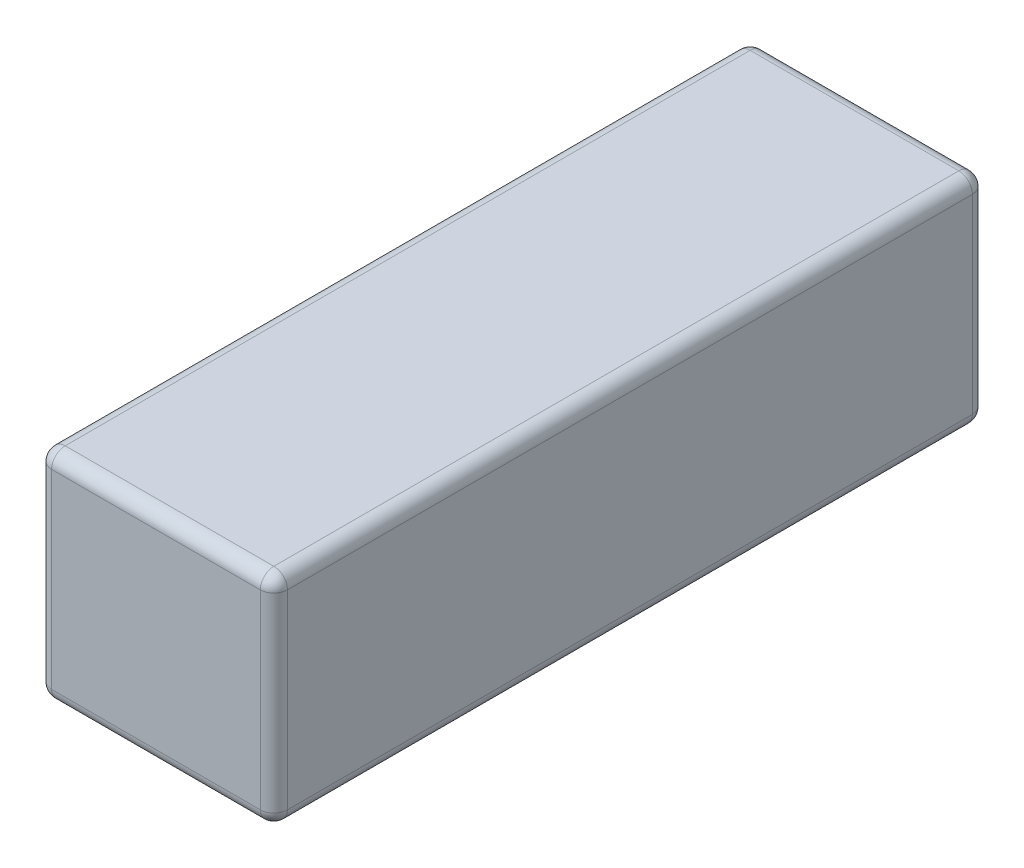
ISO-10303-21;
HEADER;
FILE_DESCRIPTION(('STEP AP214'),'2;1');
FILE_NAME('part.step','',(''),(''),'','','');
FILE_SCHEMA(('AUTOMOTIVE_DESIGN { 1 0 10303 214 1 1 1 1 }'));
ENDSEC;
DATA;
#1=APPLICATION_CONTEXT('core data for automotive mechanical design processes');
#2=APPLICATION_PROTOCOL_DEFINITION('international standard','automotive_design',2000,#1);
#3=PRODUCT_CONTEXT('',#1,'mechanical');
#4=PRODUCT('Part','Part','',(#3));
#5=PRODUCT_RELATED_PRODUCT_CATEGORY('part','',(#4));
#6=PRODUCT_DEFINITION_FORMATION('','',#4);
#7=PRODUCT_DEFINITION_CONTEXT('part definition',#1,'design');
#8=PRODUCT_DEFINITION('design','',#6,#7);
#9=PRODUCT_DEFINITION_SHAPE('','',#8);
#10=(LENGTH_UNIT() NAMED_UNIT(*) SI_UNIT(.MILLI.,.METRE.));
#11=(NAMED_UNIT(*) PLANE_ANGLE_UNIT() SI_UNIT($,.RADIAN.));
#12=(NAMED_UNIT(*) SI_UNIT($,.STERADIAN.) SOLID_ANGLE_UNIT());
#13=UNCERTAINTY_MEASURE_WITH_UNIT(LENGTH_MEASURE(1.E-05),#10,'distance_accuracy_value','');
#14=(GEOMETRIC_REPRESENTATION_CONTEXT(3) GLOBAL_UNCERTAINTY_ASSIGNED_CONTEXT((#13)) GLOBAL_UNIT_ASSIGNED_CONTEXT((#10,
#11,#12)) REPRESENTATION_CONTEXT('',''));
#15=CARTESIAN_POINT('',(0.,0.,0.));
#16=DIRECTION('',(0.,0.,1.));
#17=DIRECTION('',(1.,0.,0.));
#18=AXIS2_PLACEMENT_3D('',#15,#16,#17);
#19=CARTESIAN_POINT('',(0.,0.,157.));
#20=DIRECTION('',(1.,0.,0.));
#21=DIRECTION('',(0.,0.,-1.));
#22=AXIS2_PLACEMENT_3D('',#19,#20,#21);
#23=PLANE('',#22);
#24=DIRECTION('',(0.,-1.,0.));
#25=VECTOR('',#24,1.);
#26=CARTESIAN_POINT('',(0.,0.,3.));
#27=LINE('',#26,#25);
#28=CARTESIAN_POINT('',(0.,45.,3.));
#29=VERTEX_POINT('',#28);
#30=CARTESIAN_POINT('',(0.,3.,3.));
#31=VERTEX_POINT('',#30);
#32=EDGE_CURVE('E188',#29,#31,#27,.T.);
#33=ORIENTED_EDGE('',*,*,#32,.T.);
#34=DIRECTION('',(0.,0.,-1.));
#35=VECTOR('',#34,1.);
#36=CARTESIAN_POINT('',(0.,3.,157.));
#37=LINE('',#36,#35);
#38=CARTESIAN_POINT('',(0.,3.,154.));
#39=VERTEX_POINT('',#38);
#40=EDGE_CURVE('E190',#31,#39,#37,.F.);
#41=ORIENTED_EDGE('',*,*,#40,.T.);
#42=DIRECTION('',(0.,-1.,0.));
#43=VECTOR('',#42,1.);
#44=CARTESIAN_POINT('',(0.,0.,154.));
#45=LINE('',#44,#43);
#46=CARTESIAN_POINT('',(0.,45.,154.));
#47=VERTEX_POINT('',#46);
#48=EDGE_CURVE('E186',#39,#47,#45,.F.);
#49=ORIENTED_EDGE('',*,*,#48,.T.);
#50=DIRECTION('',(0.,0.,-1.));
#51=VECTOR('',#50,1.);
#52=CARTESIAN_POINT('',(0.,45.,157.));
#53=LINE('',#52,#51);
#54=EDGE_CURVE('E184',#47,#29,#53,.T.);
#55=ORIENTED_EDGE('',*,*,#54,.T.);
#56=EDGE_LOOP('',(#33,#41,#49,#55));
#57=FACE_BOUND('',#56,.T.);
#58=ADVANCED_FACE('F35',(#57),#23,.F.);
#59=CARTESIAN_POINT('',(0.,0.,157.));
#60=DIRECTION('',(0.,1.,0.));
#61=DIRECTION('',(0.,0.,1.));
#62=AXIS2_PLACEMENT_3D('',#59,#60,#61);
#63=PLANE('',#62);
#64=DIRECTION('',(1.,0.,0.));
#65=VECTOR('',#64,1.);
#66=CARTESIAN_POINT('',(52.,0.,3.));
#67=LINE('',#66,#65);
#68=CARTESIAN_POINT('',(3.,0.,3.));
#69=VERTEX_POINT('',#68);
#70=CARTESIAN_POINT('',(49.,0.,3.));
#71=VERTEX_POINT('',#70);
#72=EDGE_CURVE('E170',#69,#71,#67,.T.);
#73=ORIENTED_EDGE('',*,*,#72,.T.);
#74=DIRECTION('',(0.,0.,-1.));
#75=VECTOR('',#74,1.);
#76=CARTESIAN_POINT('',(49.,0.,157.));
#77=LINE('',#76,#75);
#78=CARTESIAN_POINT('',(49.,0.,154.));
#79=VERTEX_POINT('',#78);
#80=EDGE_CURVE('E172',#71,#79,#77,.F.);
#81=ORIENTED_EDGE('',*,*,#80,.T.);
#82=DIRECTION('',(1.,0.,0.));
#83=VECTOR('',#82,1.);
#84=CARTESIAN_POINT('',(0.,0.,154.));
#85=LINE('',#84,#83);
#86=CARTESIAN_POINT('',(3.,0.,154.));
#87=VERTEX_POINT('',#86);
#88=EDGE_CURVE('E166',#79,#87,#85,.F.);
#89=ORIENTED_EDGE('',*,*,#88,.T.);
#90=DIRECTION('',(0.,0.,-1.));
#91=VECTOR('',#90,1.);
#92=CARTESIAN_POINT('',(3.,0.,157.));
#93=LINE('',#92,#91);
#94=EDGE_CURVE('E168',#87,#69,#93,.T.);
#95=ORIENTED_EDGE('',*,*,#94,.T.);
#96=EDGE_LOOP('',(#73,#81,#89,#95));
#97=FACE_BOUND('',#96,.T.);
#98=ADVANCED_FACE('F332',(#97),#63,.F.);
#99=CARTESIAN_POINT('',(52.,0.,157.));
#100=DIRECTION('',(-1.,0.,0.));
#101=DIRECTION('',(0.,0.,1.));
#102=AXIS2_PLACEMENT_3D('',#99,#100,#101);
#103=PLANE('',#102);
#104=DIRECTION('',(0.,1.,0.));
#105=VECTOR('',#104,1.);
#106=CARTESIAN_POINT('',(52.,0.,154.));
#107=LINE('',#106,#105);
#108=CARTESIAN_POINT('',(52.,45.,154.));
#109=VERTEX_POINT('',#108);
#110=CARTESIAN_POINT('',(52.,3.,154.));
#111=VERTEX_POINT('',#110);
#112=EDGE_CURVE('E128',#109,#111,#107,.F.);
#113=ORIENTED_EDGE('',*,*,#112,.T.);
#114=DIRECTION('',(0.,0.,-1.));
#115=VECTOR('',#114,1.);
#116=CARTESIAN_POINT('',(52.,3.,157.));
#117=LINE('',#116,#115);
#118=CARTESIAN_POINT('',(52.,3.,3.));
#119=VERTEX_POINT('',#118);
#120=EDGE_CURVE('E164',#111,#119,#117,.T.);
#121=ORIENTED_EDGE('',*,*,#120,.T.);
#122=DIRECTION('',(0.,1.,0.));
#123=VECTOR('',#122,1.);
#124=CARTESIAN_POINT('',(52.,48.,3.));
#125=LINE('',#124,#123);
#126=CARTESIAN_POINT('',(52.,45.,3.));
#127=VERTEX_POINT('',#126);
#128=EDGE_CURVE('E131',#119,#127,#125,.T.);
#129=ORIENTED_EDGE('',*,*,#128,.T.);
#130=DIRECTION('',(0.,0.,-1.));
#131=VECTOR('',#130,1.);
#132=CARTESIAN_POINT('',(52.,45.,157.));
#133=LINE('',#132,#131);
#134=EDGE_CURVE('E123',#127,#109,#133,.F.);
#135=ORIENTED_EDGE('',*,*,#134,.T.);
#136=EDGE_LOOP('',(#113,#121,#129,#135));
#137=FACE_BOUND('',#136,.T.);
#138=ADVANCED_FACE('F125',(#137),#103,.F.);
#139=CARTESIAN_POINT('',(0.,48.,157.));
#140=DIRECTION('',(0.,-1.,0.));
#141=DIRECTION('',(0.,0.,-1.));
#142=AXIS2_PLACEMENT_3D('',#139,#140,#141);
#143=PLANE('',#142);
#144=DIRECTION('',(0.,0.,-1.));
#145=VECTOR('',#144,1.);
#146=CARTESIAN_POINT('',(49.,48.,157.));
#147=LINE('',#146,#145);
#148=CARTESIAN_POINT('',(49.,48.,154.));
#149=VERTEX_POINT('',#148);
#150=CARTESIAN_POINT('',(49.,48.,3.));
#151=VERTEX_POINT('',#150);
#152=EDGE_CURVE('E141',#149,#151,#147,.T.);
#153=ORIENTED_EDGE('',*,*,#152,.T.);
#154=DIRECTION('',(-1.,0.,0.));
#155=VECTOR('',#154,1.);
#156=CARTESIAN_POINT('',(0.,48.,3.));
#157=LINE('',#156,#155);
#158=CARTESIAN_POINT('',(3.,48.,3.));
#159=VERTEX_POINT('',#158);
#160=EDGE_CURVE('E198',#151,#159,#157,.T.);
#161=ORIENTED_EDGE('',*,*,#160,.T.);
#162=DIRECTION('',(0.,0.,-1.));
#163=VECTOR('',#162,1.);
#164=CARTESIAN_POINT('',(3.,48.,157.));
#165=LINE('',#164,#163);
#166=CARTESIAN_POINT('',(3.,48.,154.));
#167=VERTEX_POINT('',#166);
#168=EDGE_CURVE('E193',#159,#167,#165,.F.);
#169=ORIENTED_EDGE('',*,*,#168,.T.);
#170=DIRECTION('',(-1.,0.,0.));
#171=VECTOR('',#170,1.);
#172=CARTESIAN_POINT('',(0.,48.,154.));
#173=LINE('',#172,#171);
#174=EDGE_CURVE('E195',#167,#149,#173,.F.);
#175=ORIENTED_EDGE('',*,*,#174,.T.);
#176=EDGE_LOOP('',(#153,#161,#169,#175));
#177=FACE_BOUND('',#176,.T.);
#178=ADVANCED_FACE('F266',(#177),#143,.F.);
#179=CARTESIAN_POINT('',(0.,0.,157.));
#180=DIRECTION('',(0.,0.,-1.));
#181=DIRECTION('',(-1.,0.,0.));
#182=AXIS2_PLACEMENT_3D('',#179,#180,#181);
#183=PLANE('',#182);
#184=DIRECTION('',(1.,0.,0.));
#185=VECTOR('',#184,1.);
#186=CARTESIAN_POINT('',(0.,3.,157.));
#187=LINE('',#186,#185);
#188=CARTESIAN_POINT('',(3.,3.,157.));
#189=VERTEX_POINT('',#188);
#190=CARTESIAN_POINT('',(49.,3.,157.));
#191=VERTEX_POINT('',#190);
#192=EDGE_CURVE('E44',#189,#191,#187,.T.);
#193=ORIENTED_EDGE('',*,*,#192,.T.);
#194=DIRECTION('',(0.,1.,0.));
#195=VECTOR('',#194,1.);
#196=CARTESIAN_POINT('',(49.,0.,157.));
#197=LINE('',#196,#195);
#198=CARTESIAN_POINT('',(49.,45.,157.));
#199=VERTEX_POINT('',#198);
#200=EDGE_CURVE('E11',#191,#199,#197,.T.);
#201=ORIENTED_EDGE('',*,*,#200,.T.);
#202=DIRECTION('',(-1.,0.,0.));
#203=VECTOR('',#202,1.);
#204=CARTESIAN_POINT('',(0.,45.,157.));
#205=LINE('',#204,#203);
#206=CARTESIAN_POINT('',(3.,45.,157.));
#207=VERTEX_POINT('',#206);
#208=EDGE_CURVE('E201',#199,#207,#205,.T.);
#209=ORIENTED_EDGE('',*,*,#208,.T.);
#210=DIRECTION('',(0.,-1.,0.));
#211=VECTOR('',#210,1.);
#212=CARTESIAN_POINT('',(3.,0.,157.));
#213=LINE('',#212,#211);
#214=EDGE_CURVE('E55',#207,#189,#213,.T.);
#215=ORIENTED_EDGE('',*,*,#214,.T.);
#216=EDGE_LOOP('',(#193,#201,#209,#215));
#217=FACE_BOUND('',#216,.T.);
#218=ADVANCED_FACE('F303',(#217),#183,.F.);
#219=CARTESIAN_POINT('',(0.,0.,0.));
#220=DIRECTION('',(0.,0.,-1.));
#221=DIRECTION('',(-1.,0.,0.));
#222=AXIS2_PLACEMENT_3D('',#219,#220,#221);
#223=PLANE('',#222);
#224=DIRECTION('',(-1.,0.,0.));
#225=VECTOR('',#224,1.);
#226=CARTESIAN_POINT('',(52.,45.,0.));
#227=LINE('',#226,#225);
#228=CARTESIAN_POINT('',(3.,45.,0.));
#229=VERTEX_POINT('',#228);
#230=CARTESIAN_POINT('',(49.,45.,0.));
#231=VERTEX_POINT('',#230);
#232=EDGE_CURVE('E175',#229,#231,#227,.F.);
#233=ORIENTED_EDGE('',*,*,#232,.T.);
#234=DIRECTION('',(0.,1.,0.));
#235=VECTOR('',#234,1.);
#236=CARTESIAN_POINT('',(49.,0.,0.));
#237=LINE('',#236,#235);
#238=CARTESIAN_POINT('',(49.,3.,0.));
#239=VERTEX_POINT('',#238);
#240=EDGE_CURVE('E181',#231,#239,#237,.F.);
#241=ORIENTED_EDGE('',*,*,#240,.T.);
#242=DIRECTION('',(1.,0.,0.));
#243=VECTOR('',#242,1.);
#244=CARTESIAN_POINT('',(0.,3.,0.));
#245=LINE('',#244,#243);
#246=CARTESIAN_POINT('',(3.,3.,0.));
#247=VERTEX_POINT('',#246);
#248=EDGE_CURVE('E179',#239,#247,#245,.F.);
#249=ORIENTED_EDGE('',*,*,#248,.T.);
#250=DIRECTION('',(0.,-1.,0.));
#251=VECTOR('',#250,1.);
#252=CARTESIAN_POINT('',(3.,48.,0.));
#253=LINE('',#252,#251);
#254=EDGE_CURVE('E177',#247,#229,#253,.F.);
#255=ORIENTED_EDGE('',*,*,#254,.T.);
#256=EDGE_LOOP('',(#233,#241,#249,#255));
#257=FACE_BOUND('',#256,.T.);
#258=ADVANCED_FACE('F279',(#257),#223,.T.);
#259=CARTESIAN_POINT('',(3.,45.,157.));
#260=DIRECTION('',(0.,0.,-1.));
#261=DIRECTION('',(-1.,0.,0.));
#262=AXIS2_PLACEMENT_3D('',#259,#260,#261);
#263=CYLINDRICAL_SURFACE('',#262,3.);
#264=CARTESIAN_POINT('',(3.,45.,154.));
#265=DIRECTION('',(0.,0.,1.));
#266=DIRECTION('',(1.,0.,0.));
#267=AXIS2_PLACEMENT_3D('',#264,#265,#266);
#268=CIRCLE('',#267,3.);
#269=EDGE_CURVE('E39',#167,#47,#268,.T.);
#270=ORIENTED_EDGE('',*,*,#269,.F.);
#271=ORIENTED_EDGE('',*,*,#168,.F.);
#272=CARTESIAN_POINT('',(3.,45.,3.));
#273=DIRECTION('',(0.,0.,-1.));
#274=DIRECTION('',(-1.,0.,0.));
#275=AXIS2_PLACEMENT_3D('',#272,#273,#274);
#276=CIRCLE('',#275,3.);
#277=EDGE_CURVE('E161',#29,#159,#276,.T.);
#278=ORIENTED_EDGE('',*,*,#277,.F.);
#279=ORIENTED_EDGE('',*,*,#54,.F.);
#280=EDGE_LOOP('',(#270,#271,#278,#279));
#281=FACE_BOUND('',#280,.T.);
#282=ADVANCED_FACE('F37',(#281),#263,.T.);
#283=CARTESIAN_POINT('',(3.,45.,154.));
#284=DIRECTION('',(0.,0.,1.));
#285=DIRECTION('',(1.,0.,0.));
#286=AXIS2_PLACEMENT_3D('',#283,#284,#285);
#287=SPHERICAL_SURFACE('',#286,3.);
#288=CARTESIAN_POINT('',(3.,45.,154.));
#289=DIRECTION('',(-1.,0.,0.));
#290=DIRECTION('',(0.,0.,1.));
#291=AXIS2_PLACEMENT_3D('',#288,#289,#290);
#292=CIRCLE('',#291,3.);
#293=EDGE_CURVE('E246',#167,#207,#292,.F.);
#294=ORIENTED_EDGE('',*,*,#293,.F.);
#295=ORIENTED_EDGE('',*,*,#269,.T.);
#296=CARTESIAN_POINT('',(3.,45.,154.));
#297=DIRECTION('',(0.,1.,0.));
#298=DIRECTION('',(0.,0.,1.));
#299=AXIS2_PLACEMENT_3D('',#296,#297,#298);
#300=CIRCLE('',#299,3.);
#301=EDGE_CURVE('E249',#207,#47,#300,.F.);
#302=ORIENTED_EDGE('',*,*,#301,.F.);
#303=EDGE_LOOP('',(#294,#295,#302));
#304=FACE_BOUND('',#303,.T.);
#305=ADVANCED_FACE('F299',(#304),#287,.T.);
#306=CARTESIAN_POINT('',(3.,45.,3.));
#307=DIRECTION('',(0.,0.,1.));
#308=DIRECTION('',(1.,0.,0.));
#309=AXIS2_PLACEMENT_3D('',#306,#307,#308);
#310=SPHERICAL_SURFACE('',#309,3.);
#311=CARTESIAN_POINT('',(3.,45.,3.));
#312=DIRECTION('',(0.,1.,0.));
#313=DIRECTION('',(0.,0.,1.));
#314=AXIS2_PLACEMENT_3D('',#311,#312,#313);
#315=CIRCLE('',#314,3.);
#316=EDGE_CURVE('E241',#29,#229,#315,.F.);
#317=ORIENTED_EDGE('',*,*,#316,.F.);
#318=ORIENTED_EDGE('',*,*,#277,.T.);
#319=CARTESIAN_POINT('',(3.,45.,3.));
#320=DIRECTION('',(-1.,0.,0.));
#321=DIRECTION('',(0.,0.,1.));
#322=AXIS2_PLACEMENT_3D('',#319,#320,#321);
#323=CIRCLE('',#322,3.);
#324=EDGE_CURVE('E244',#229,#159,#323,.F.);
#325=ORIENTED_EDGE('',*,*,#324,.F.);
#326=EDGE_LOOP('',(#317,#318,#325));
#327=FACE_BOUND('',#326,.T.);
#328=ADVANCED_FACE('F257',(#327),#310,.T.);
#329=CARTESIAN_POINT('',(3.,0.,154.));
#330=DIRECTION('',(0.,-1.,0.));
#331=DIRECTION('',(0.,0.,-1.));
#332=AXIS2_PLACEMENT_3D('',#329,#330,#331);
#333=CYLINDRICAL_SURFACE('',#332,3.);
#334=ORIENTED_EDGE('',*,*,#301,.T.);
#335=ORIENTED_EDGE('',*,*,#48,.F.);
#336=CARTESIAN_POINT('',(3.,3.,154.));
#337=DIRECTION('',(0.,-1.,0.));
#338=DIRECTION('',(0.,0.,-1.));
#339=AXIS2_PLACEMENT_3D('',#336,#337,#338);
#340=CIRCLE('',#339,3.);
#341=EDGE_CURVE('E236',#189,#39,#340,.T.);
#342=ORIENTED_EDGE('',*,*,#341,.F.);
#343=ORIENTED_EDGE('',*,*,#214,.F.);
#344=EDGE_LOOP('',(#334,#335,#342,#343));
#345=FACE_BOUND('',#344,.T.);
#346=ADVANCED_FACE('F296',(#345),#333,.T.);
#347=CARTESIAN_POINT('',(0.,45.,154.));
#348=DIRECTION('',(-1.,0.,0.));
#349=DIRECTION('',(0.,0.,1.));
#350=AXIS2_PLACEMENT_3D('',#347,#348,#349);
#351=CYLINDRICAL_SURFACE('',#350,3.);
#352=ORIENTED_EDGE('',*,*,#293,.T.);
#353=ORIENTED_EDGE('',*,*,#208,.F.);
#354=CARTESIAN_POINT('',(49.,45.,154.));
#355=DIRECTION('',(1.,0.,0.));
#356=DIRECTION('',(0.,0.,-1.));
#357=AXIS2_PLACEMENT_3D('',#354,#355,#356);
#358=CIRCLE('',#357,3.);
#359=EDGE_CURVE('E145',#149,#199,#358,.T.);
#360=ORIENTED_EDGE('',*,*,#359,.F.);
#361=ORIENTED_EDGE('',*,*,#174,.F.);
#362=EDGE_LOOP('',(#352,#353,#360,#361));
#363=FACE_BOUND('',#362,.T.);
#364=ADVANCED_FACE('F302',(#363),#351,.T.);
#365=CARTESIAN_POINT('',(49.,45.,157.));
#366=DIRECTION('',(0.,0.,-1.));
#367=DIRECTION('',(-1.,0.,0.));
#368=AXIS2_PLACEMENT_3D('',#365,#366,#367);
#369=CYLINDRICAL_SURFACE('',#368,3.);
#370=CARTESIAN_POINT('',(49.,45.,3.));
#371=DIRECTION('',(0.,0.,-1.));
#372=DIRECTION('',(-1.,0.,0.));
#373=AXIS2_PLACEMENT_3D('',#370,#371,#372);
#374=CIRCLE('',#373,3.);
#375=EDGE_CURVE('E146',#151,#127,#374,.T.);
#376=ORIENTED_EDGE('',*,*,#375,.F.);
#377=ORIENTED_EDGE('',*,*,#152,.F.);
#378=CARTESIAN_POINT('',(49.,45.,154.));
#379=DIRECTION('',(0.,0.,1.));
#380=DIRECTION('',(1.,0.,0.));
#381=AXIS2_PLACEMENT_3D('',#378,#379,#380);
#382=CIRCLE('',#381,3.);
#383=EDGE_CURVE('E138',#109,#149,#382,.T.);
#384=ORIENTED_EDGE('',*,*,#383,.F.);
#385=ORIENTED_EDGE('',*,*,#134,.F.);
#386=EDGE_LOOP('',(#376,#377,#384,#385));
#387=FACE_BOUND('',#386,.T.);
#388=ADVANCED_FACE('F140',(#387),#369,.T.);
#389=CARTESIAN_POINT('',(0.,45.,3.));
#390=DIRECTION('',(1.,0.,0.));
#391=DIRECTION('',(0.,0.,-1.));
#392=AXIS2_PLACEMENT_3D('',#389,#390,#391);
#393=CYLINDRICAL_SURFACE('',#392,3.);
#394=ORIENTED_EDGE('',*,*,#324,.T.);
#395=ORIENTED_EDGE('',*,*,#160,.F.);
#396=CARTESIAN_POINT('',(49.,45.,3.));
#397=DIRECTION('',(1.,0.,0.));
#398=DIRECTION('',(0.,0.,-1.));
#399=AXIS2_PLACEMENT_3D('',#396,#397,#398);
#400=CIRCLE('',#399,3.);
#401=EDGE_CURVE('E231',#231,#151,#400,.T.);
#402=ORIENTED_EDGE('',*,*,#401,.F.);
#403=ORIENTED_EDGE('',*,*,#232,.F.);
#404=EDGE_LOOP('',(#394,#395,#402,#403));
#405=FACE_BOUND('',#404,.T.);
#406=ADVANCED_FACE('F269',(#405),#393,.T.);
#407=CARTESIAN_POINT('',(3.,0.,3.));
#408=DIRECTION('',(0.,1.,0.));
#409=DIRECTION('',(0.,0.,1.));
#410=AXIS2_PLACEMENT_3D('',#407,#408,#409);
#411=CYLINDRICAL_SURFACE('',#410,3.);
#412=ORIENTED_EDGE('',*,*,#316,.T.);
#413=ORIENTED_EDGE('',*,*,#254,.F.);
#414=CARTESIAN_POINT('',(3.,3.,3.));
#415=DIRECTION('',(0.,-1.,0.));
#416=DIRECTION('',(0.,0.,-1.));
#417=AXIS2_PLACEMENT_3D('',#414,#415,#416);
#418=CIRCLE('',#417,3.);
#419=EDGE_CURVE('E228',#31,#247,#418,.T.);
#420=ORIENTED_EDGE('',*,*,#419,.F.);
#421=ORIENTED_EDGE('',*,*,#32,.F.);
#422=EDGE_LOOP('',(#412,#413,#420,#421));
#423=FACE_BOUND('',#422,.T.);
#424=ADVANCED_FACE('F283',(#423),#411,.T.);
#425=CARTESIAN_POINT('',(3.,3.,157.));
#426=DIRECTION('',(0.,0.,-1.));
#427=DIRECTION('',(-1.,0.,0.));
#428=AXIS2_PLACEMENT_3D('',#425,#426,#427);
#429=CYLINDRICAL_SURFACE('',#428,3.);
#430=CARTESIAN_POINT('',(3.,3.,154.));
#431=DIRECTION('',(0.,0.,1.));
#432=DIRECTION('',(1.,0.,0.));
#433=AXIS2_PLACEMENT_3D('',#430,#431,#432);
#434=CIRCLE('',#433,3.);
#435=EDGE_CURVE('E238',#39,#87,#434,.T.);
#436=ORIENTED_EDGE('',*,*,#435,.F.);
#437=ORIENTED_EDGE('',*,*,#40,.F.);
#438=CARTESIAN_POINT('',(3.,3.,3.));
#439=DIRECTION('',(0.,0.,-1.));
#440=DIRECTION('',(-1.,0.,0.));
#441=AXIS2_PLACEMENT_3D('',#438,#439,#440);
#442=CIRCLE('',#441,3.);
#443=EDGE_CURVE('E225',#69,#31,#442,.T.);
#444=ORIENTED_EDGE('',*,*,#443,.F.);
#445=ORIENTED_EDGE('',*,*,#94,.F.);
#446=EDGE_LOOP('',(#436,#437,#444,#445));
#447=FACE_BOUND('',#446,.T.);
#448=ADVANCED_FACE('F289',(#447),#429,.T.);
#449=CARTESIAN_POINT('',(3.,3.,154.));
#450=DIRECTION('',(0.,0.,1.));
#451=DIRECTION('',(1.,0.,0.));
#452=AXIS2_PLACEMENT_3D('',#449,#450,#451);
#453=SPHERICAL_SURFACE('',#452,3.);
#454=ORIENTED_EDGE('',*,*,#341,.T.);
#455=ORIENTED_EDGE('',*,*,#435,.T.);
#456=CARTESIAN_POINT('',(3.,3.,154.));
#457=DIRECTION('',(-1.,0.,0.));
#458=DIRECTION('',(0.,0.,1.));
#459=AXIS2_PLACEMENT_3D('',#456,#457,#458);
#460=CIRCLE('',#459,3.);
#461=EDGE_CURVE('E152',#189,#87,#460,.F.);
#462=ORIENTED_EDGE('',*,*,#461,.F.);
#463=EDGE_LOOP('',(#454,#455,#462));
#464=FACE_BOUND('',#463,.T.);
#465=ADVANCED_FACE('F409',(#464),#453,.T.);
#466=CARTESIAN_POINT('',(49.,45.,154.));
#467=DIRECTION('',(0.,0.,1.));
#468=DIRECTION('',(1.,0.,0.));
#469=AXIS2_PLACEMENT_3D('',#466,#467,#468);
#470=SPHERICAL_SURFACE('',#469,3.);
#471=ORIENTED_EDGE('',*,*,#383,.T.);
#472=ORIENTED_EDGE('',*,*,#359,.T.);
#473=CARTESIAN_POINT('',(49.,45.,154.));
#474=DIRECTION('',(0.,1.,0.));
#475=DIRECTION('',(0.,0.,1.));
#476=AXIS2_PLACEMENT_3D('',#473,#474,#475);
#477=CIRCLE('',#476,3.);
#478=EDGE_CURVE('E148',#109,#199,#477,.F.);
#479=ORIENTED_EDGE('',*,*,#478,.F.);
#480=EDGE_LOOP('',(#471,#472,#479));
#481=FACE_BOUND('',#480,.T.);
#482=ADVANCED_FACE('F149',(#481),#470,.T.);
#483=CARTESIAN_POINT('',(49.,45.,3.));
#484=DIRECTION('',(0.,0.,1.));
#485=DIRECTION('',(1.,0.,0.));
#486=AXIS2_PLACEMENT_3D('',#483,#484,#485);
#487=SPHERICAL_SURFACE('',#486,3.);
#488=ORIENTED_EDGE('',*,*,#401,.T.);
#489=ORIENTED_EDGE('',*,*,#375,.T.);
#490=CARTESIAN_POINT('',(49.,45.,3.));
#491=DIRECTION('',(0.,1.,0.));
#492=DIRECTION('',(0.,0.,1.));
#493=AXIS2_PLACEMENT_3D('',#490,#491,#492);
#494=CIRCLE('',#493,3.);
#495=EDGE_CURVE('E153',#231,#127,#494,.F.);
#496=ORIENTED_EDGE('',*,*,#495,.F.);
#497=EDGE_LOOP('',(#488,#489,#496));
#498=FACE_BOUND('',#497,.T.);
#499=ADVANCED_FACE('F272',(#498),#487,.T.);
#500=CARTESIAN_POINT('',(3.,3.,3.));
#501=DIRECTION('',(0.,0.,1.));
#502=DIRECTION('',(1.,0.,0.));
#503=AXIS2_PLACEMENT_3D('',#500,#501,#502);
#504=SPHERICAL_SURFACE('',#503,3.);
#505=ORIENTED_EDGE('',*,*,#443,.T.);
#506=ORIENTED_EDGE('',*,*,#419,.T.);
#507=CARTESIAN_POINT('',(3.,3.,3.));
#508=DIRECTION('',(-1.,0.,0.));
#509=DIRECTION('',(0.,0.,1.));
#510=AXIS2_PLACEMENT_3D('',#507,#508,#509);
#511=CIRCLE('',#510,3.);
#512=EDGE_CURVE('E218',#69,#247,#511,.F.);
#513=ORIENTED_EDGE('',*,*,#512,.F.);
#514=EDGE_LOOP('',(#505,#506,#513));
#515=FACE_BOUND('',#514,.T.);
#516=ADVANCED_FACE('F322',(#515),#504,.T.);
#517=CARTESIAN_POINT('',(0.,3.,154.));
#518=DIRECTION('',(1.,0.,0.));
#519=DIRECTION('',(0.,0.,-1.));
#520=AXIS2_PLACEMENT_3D('',#517,#518,#519);
#521=CYLINDRICAL_SURFACE('',#520,3.);
#522=ORIENTED_EDGE('',*,*,#461,.T.);
#523=ORIENTED_EDGE('',*,*,#88,.F.);
#524=CARTESIAN_POINT('',(49.,3.,154.));
#525=DIRECTION('',(1.,0.,0.));
#526=DIRECTION('',(0.,0.,-1.));
#527=AXIS2_PLACEMENT_3D('',#524,#525,#526);
#528=CIRCLE('',#527,3.);
#529=EDGE_CURVE('E215',#191,#79,#528,.T.);
#530=ORIENTED_EDGE('',*,*,#529,.F.);
#531=ORIENTED_EDGE('',*,*,#192,.F.);
#532=EDGE_LOOP('',(#522,#523,#530,#531));
#533=FACE_BOUND('',#532,.T.);
#534=ADVANCED_FACE('F307',(#533),#521,.T.);
#535=CARTESIAN_POINT('',(49.,0.,154.));
#536=DIRECTION('',(0.,1.,0.));
#537=DIRECTION('',(0.,0.,1.));
#538=AXIS2_PLACEMENT_3D('',#535,#536,#537);
#539=CYLINDRICAL_SURFACE('',#538,3.);
#540=ORIENTED_EDGE('',*,*,#478,.T.);
#541=ORIENTED_EDGE('',*,*,#200,.F.);
#542=CARTESIAN_POINT('',(49.,3.,154.));
#543=DIRECTION('',(0.,-1.,0.));
#544=DIRECTION('',(0.,0.,-1.));
#545=AXIS2_PLACEMENT_3D('',#542,#543,#544);
#546=CIRCLE('',#545,3.);
#547=EDGE_CURVE('E157',#111,#191,#546,.T.);
#548=ORIENTED_EDGE('',*,*,#547,.F.);
#549=ORIENTED_EDGE('',*,*,#112,.F.);
#550=EDGE_LOOP('',(#540,#541,#548,#549));
#551=FACE_BOUND('',#550,.T.);
#552=ADVANCED_FACE('F155',(#551),#539,.T.);
#553=CARTESIAN_POINT('',(49.,0.,3.));
#554=DIRECTION('',(0.,-1.,0.));
#555=DIRECTION('',(0.,0.,-1.));
#556=AXIS2_PLACEMENT_3D('',#553,#554,#555);
#557=CYLINDRICAL_SURFACE('',#556,3.);
#558=ORIENTED_EDGE('',*,*,#495,.T.);
#559=ORIENTED_EDGE('',*,*,#128,.F.);
#560=CARTESIAN_POINT('',(49.,3.,3.));
#561=DIRECTION('',(0.,-1.,0.));
#562=DIRECTION('',(0.,0.,-1.));
#563=AXIS2_PLACEMENT_3D('',#560,#561,#562);
#564=CIRCLE('',#563,3.);
#565=EDGE_CURVE('E211',#239,#119,#564,.T.);
#566=ORIENTED_EDGE('',*,*,#565,.F.);
#567=ORIENTED_EDGE('',*,*,#240,.F.);
#568=EDGE_LOOP('',(#558,#559,#566,#567));
#569=FACE_BOUND('',#568,.T.);
#570=ADVANCED_FACE('F276',(#569),#557,.T.);
#571=CARTESIAN_POINT('',(0.,3.,3.));
#572=DIRECTION('',(-1.,0.,0.));
#573=DIRECTION('',(0.,0.,1.));
#574=AXIS2_PLACEMENT_3D('',#571,#572,#573);
#575=CYLINDRICAL_SURFACE('',#574,3.);
#576=ORIENTED_EDGE('',*,*,#512,.T.);
#577=ORIENTED_EDGE('',*,*,#248,.F.);
#578=CARTESIAN_POINT('',(49.,3.,3.));
#579=DIRECTION('',(1.,0.,0.));
#580=DIRECTION('',(0.,0.,-1.));
#581=AXIS2_PLACEMENT_3D('',#578,#579,#580);
#582=CIRCLE('',#581,3.);
#583=EDGE_CURVE('E209',#71,#239,#582,.T.);
#584=ORIENTED_EDGE('',*,*,#583,.F.);
#585=ORIENTED_EDGE('',*,*,#72,.F.);
#586=EDGE_LOOP('',(#576,#577,#584,#585));
#587=FACE_BOUND('',#586,.T.);
#588=ADVANCED_FACE('F320',(#587),#575,.T.);
#589=CARTESIAN_POINT('',(49.,3.,154.));
#590=DIRECTION('',(0.,0.,1.));
#591=DIRECTION('',(1.,0.,0.));
#592=AXIS2_PLACEMENT_3D('',#589,#590,#591);
#593=SPHERICAL_SURFACE('',#592,3.);
#594=ORIENTED_EDGE('',*,*,#547,.T.);
#595=ORIENTED_EDGE('',*,*,#529,.T.);
#596=CARTESIAN_POINT('',(49.,3.,154.));
#597=DIRECTION('',(0.,0.,1.));
#598=DIRECTION('',(1.,0.,0.));
#599=AXIS2_PLACEMENT_3D('',#596,#597,#598);
#600=CIRCLE('',#599,3.);
#601=EDGE_CURVE('E207',#111,#79,#600,.F.);
#602=ORIENTED_EDGE('',*,*,#601,.F.);
#603=EDGE_LOOP('',(#594,#595,#602));
#604=FACE_BOUND('',#603,.T.);
#605=ADVANCED_FACE('F309',(#604),#593,.T.);
#606=CARTESIAN_POINT('',(49.,3.,3.));
#607=DIRECTION('',(0.,0.,1.));
#608=DIRECTION('',(1.,0.,0.));
#609=AXIS2_PLACEMENT_3D('',#606,#607,#608);
#610=SPHERICAL_SURFACE('',#609,3.);
#611=ORIENTED_EDGE('',*,*,#583,.T.);
#612=ORIENTED_EDGE('',*,*,#565,.T.);
#613=CARTESIAN_POINT('',(49.,3.,3.));
#614=DIRECTION('',(0.,0.,-1.));
#615=DIRECTION('',(-1.,0.,0.));
#616=AXIS2_PLACEMENT_3D('',#613,#614,#615);
#617=CIRCLE('',#616,3.);
#618=EDGE_CURVE('E205',#71,#119,#617,.F.);
#619=ORIENTED_EDGE('',*,*,#618,.F.);
#620=EDGE_LOOP('',(#611,#612,#619));
#621=FACE_BOUND('',#620,.T.);
#622=ADVANCED_FACE('F316',(#621),#610,.T.);
#623=CARTESIAN_POINT('',(49.,3.,157.));
#624=DIRECTION('',(0.,0.,-1.));
#625=DIRECTION('',(-1.,0.,0.));
#626=AXIS2_PLACEMENT_3D('',#623,#624,#625);
#627=CYLINDRICAL_SURFACE('',#626,3.);
#628=ORIENTED_EDGE('',*,*,#601,.T.);
#629=ORIENTED_EDGE('',*,*,#80,.F.);
#630=ORIENTED_EDGE('',*,*,#618,.T.);
#631=ORIENTED_EDGE('',*,*,#120,.F.);
#632=EDGE_LOOP('',(#628,#629,#630,#631));
#633=FACE_BOUND('',#632,.T.);
#634=ADVANCED_FACE('F313',(#633),#627,.T.);
#635=CLOSED_SHELL('',(#58,#98,#138,#178,#218,#258,#282,#305,#328,#346,#364,#388,#406,#424,#448,
#465,#482,#499,#516,#534,#552,#570,#588,#605,#622,#634));
#636=MANIFOLD_SOLID_BREP('B2',#635);
#637=ADVANCED_BREP_SHAPE_REPRESENTATION('',(#18,#636),#14);
#638=SHAPE_DEFINITION_REPRESENTATION(#9,#637);
ENDSEC;
END-ISO-10303-21;
